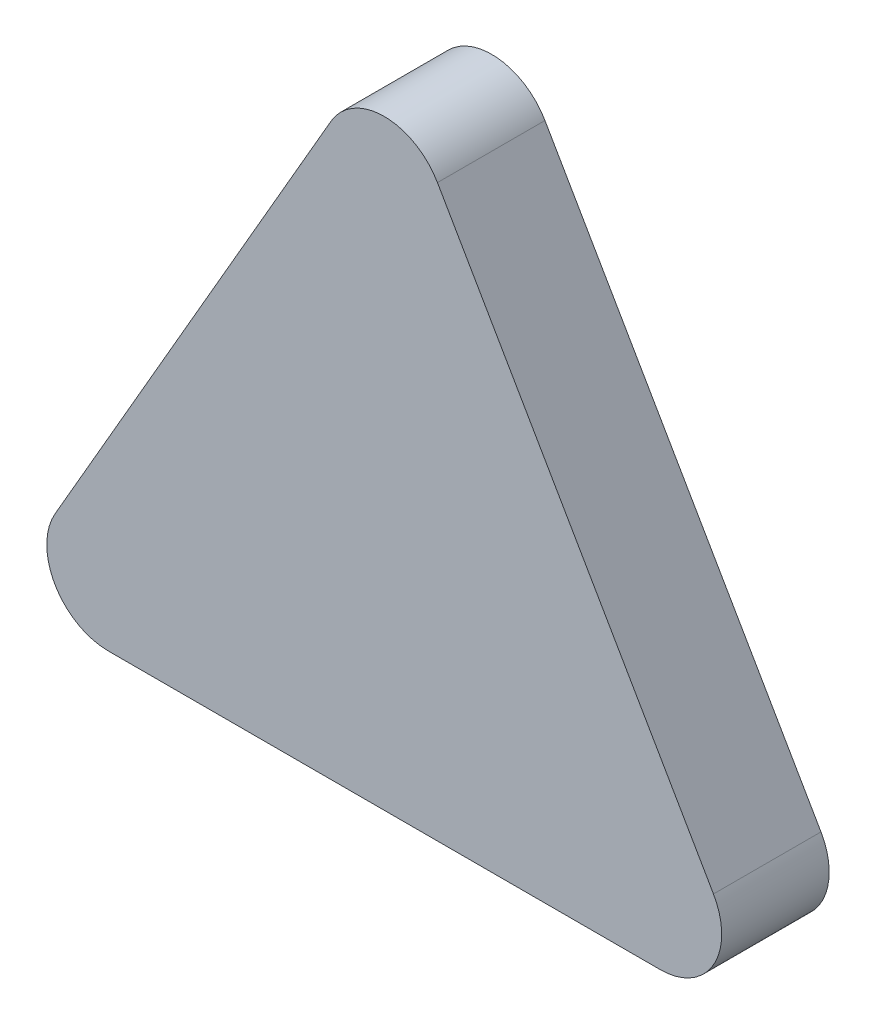
ISO-10303-21;
HEADER;
FILE_DESCRIPTION(('STEP AP214'),'2;1');
FILE_NAME('part.step','',(''),(''),'','','');
FILE_SCHEMA(('AUTOMOTIVE_DESIGN { 1 0 10303 214 1 1 1 1 }'));
ENDSEC;
DATA;
#1=APPLICATION_CONTEXT('core data for automotive mechanical design processes');
#2=APPLICATION_PROTOCOL_DEFINITION('international standard','automotive_design',2000,#1);
#3=PRODUCT_CONTEXT('',#1,'mechanical');
#4=PRODUCT('Part','Part','',(#3));
#5=PRODUCT_RELATED_PRODUCT_CATEGORY('part','',(#4));
#6=PRODUCT_DEFINITION_FORMATION('','',#4);
#7=PRODUCT_DEFINITION_CONTEXT('part definition',#1,'design');
#8=PRODUCT_DEFINITION('design','',#6,#7);
#9=PRODUCT_DEFINITION_SHAPE('','',#8);
#10=(LENGTH_UNIT() NAMED_UNIT(*) SI_UNIT(.MILLI.,.METRE.));
#11=(NAMED_UNIT(*) PLANE_ANGLE_UNIT() SI_UNIT($,.RADIAN.));
#12=(NAMED_UNIT(*) SI_UNIT($,.STERADIAN.) SOLID_ANGLE_UNIT());
#13=UNCERTAINTY_MEASURE_WITH_UNIT(LENGTH_MEASURE(1.E-05),#10,'distance_accuracy_value','');
#14=(GEOMETRIC_REPRESENTATION_CONTEXT(3) GLOBAL_UNCERTAINTY_ASSIGNED_CONTEXT((#13)) GLOBAL_UNIT_ASSIGNED_CONTEXT((#10,
#11,#12)) REPRESENTATION_CONTEXT('',''));
#15=CARTESIAN_POINT('',(0.,0.,0.));
#16=DIRECTION('',(0.,0.,1.));
#17=DIRECTION('',(1.,0.,0.));
#18=AXIS2_PLACEMENT_3D('',#15,#16,#17);
#19=CARTESIAN_POINT('',(0.,21.5640325542325,3.5));
#20=DIRECTION('',(0.866025403784439,-0.5,0.));
#21=DIRECTION('',(0.5,0.866025403784439,0.));
#22=AXIS2_PLACEMENT_3D('',#19,#20,#21);
#23=PLANE('',#22);
#24=DIRECTION('',(-0.5,-0.866025403784439,0.));
#25=VECTOR('',#24,1.);
#26=CARTESIAN_POINT('',(0.,21.5640325542325,0.));
#27=LINE('',#26,#25);
#28=CARTESIAN_POINT('',(-1.73205080756888,18.5640325542325,0.));
#29=VERTEX_POINT('',#28);
#30=CARTESIAN_POINT('',(-10.7179491924311,3.,0.));
#31=VERTEX_POINT('',#30);
#32=EDGE_CURVE('E149',#29,#31,#27,.T.);
#33=ORIENTED_EDGE('',*,*,#32,.T.);
#34=DIRECTION('',(0.,0.,-1.));
#35=VECTOR('',#34,1.);
#36=CARTESIAN_POINT('',(-10.7179491924311,3.,3.5));
#37=LINE('',#36,#35);
#38=CARTESIAN_POINT('',(-10.7179491924311,3.,3.5));
#39=VERTEX_POINT('',#38);
#40=EDGE_CURVE('E12',#31,#39,#37,.F.);
#41=ORIENTED_EDGE('',*,*,#40,.T.);
#42=DIRECTION('',(-0.5,-0.866025403784439,0.));
#43=VECTOR('',#42,1.);
#44=CARTESIAN_POINT('',(0.,21.5640325542325,3.5));
#45=LINE('',#44,#43);
#46=CARTESIAN_POINT('',(-1.73205080756888,18.5640325542325,3.5));
#47=VERTEX_POINT('',#46);
#48=EDGE_CURVE('E150',#47,#39,#45,.T.);
#49=ORIENTED_EDGE('',*,*,#48,.F.);
#50=DIRECTION('',(0.,0.,-1.));
#51=VECTOR('',#50,1.);
#52=CARTESIAN_POINT('',(-1.73205080756888,18.5640325542325,3.5));
#53=LINE('',#52,#51);
#54=EDGE_CURVE('E42',#47,#29,#53,.T.);
#55=ORIENTED_EDGE('',*,*,#54,.T.);
#56=EDGE_LOOP('',(#33,#41,#49,#55));
#57=FACE_BOUND('',#56,.T.);
#58=ADVANCED_FACE('F34',(#57),#23,.F.);
#59=CARTESIAN_POINT('',(-12.45,0.,3.5));
#60=DIRECTION('',(0.,1.,0.));
#61=DIRECTION('',(0.,0.,1.));
#62=AXIS2_PLACEMENT_3D('',#59,#60,#61);
#63=PLANE('',#62);
#64=DIRECTION('',(1.,0.,0.));
#65=VECTOR('',#64,1.);
#66=CARTESIAN_POINT('',(-12.45,0.,0.));
#67=LINE('',#66,#65);
#68=CARTESIAN_POINT('',(-8.98589838486225,0.,0.));
#69=VERTEX_POINT('',#68);
#70=CARTESIAN_POINT('',(8.98589838486225,0.,0.));
#71=VERTEX_POINT('',#70);
#72=EDGE_CURVE('E160',#69,#71,#67,.T.);
#73=ORIENTED_EDGE('',*,*,#72,.T.);
#74=DIRECTION('',(0.,0.,-1.));
#75=VECTOR('',#74,1.);
#76=CARTESIAN_POINT('',(8.98589838486225,0.,3.5));
#77=LINE('',#76,#75);
#78=CARTESIAN_POINT('',(8.98589838486225,0.,3.5));
#79=VERTEX_POINT('',#78);
#80=EDGE_CURVE('E178',#71,#79,#77,.F.);
#81=ORIENTED_EDGE('',*,*,#80,.T.);
#82=DIRECTION('',(1.,0.,0.));
#83=VECTOR('',#82,1.);
#84=CARTESIAN_POINT('',(-12.45,0.,3.5));
#85=LINE('',#84,#83);
#86=CARTESIAN_POINT('',(-8.98589838486225,0.,3.5));
#87=VERTEX_POINT('',#86);
#88=EDGE_CURVE('E152',#87,#79,#85,.T.);
#89=ORIENTED_EDGE('',*,*,#88,.F.);
#90=DIRECTION('',(0.,0.,-1.));
#91=VECTOR('',#90,1.);
#92=CARTESIAN_POINT('',(-8.98589838486225,0.,3.5));
#93=LINE('',#92,#91);
#94=EDGE_CURVE('E175',#87,#69,#93,.T.);
#95=ORIENTED_EDGE('',*,*,#94,.T.);
#96=EDGE_LOOP('',(#73,#81,#89,#95));
#97=FACE_BOUND('',#96,.T.);
#98=ADVANCED_FACE('F198',(#97),#63,.F.);
#99=CARTESIAN_POINT('',(12.45,0.,3.5));
#100=DIRECTION('',(-0.866025403784439,-0.5,0.));
#101=DIRECTION('',(0.5,-0.866025403784439,0.));
#102=AXIS2_PLACEMENT_3D('',#99,#100,#101);
#103=PLANE('',#102);
#104=DIRECTION('',(-0.5,0.866025403784439,0.));
#105=VECTOR('',#104,1.);
#106=CARTESIAN_POINT('',(12.45,0.,3.5));
#107=LINE('',#106,#105);
#108=CARTESIAN_POINT('',(10.7179491924311,3.,3.5));
#109=VERTEX_POINT('',#108);
#110=CARTESIAN_POINT('',(1.73205080756888,18.5640325542325,3.5));
#111=VERTEX_POINT('',#110);
#112=EDGE_CURVE('E156',#109,#111,#107,.T.);
#113=ORIENTED_EDGE('',*,*,#112,.F.);
#114=DIRECTION('',(0.,0.,-1.));
#115=VECTOR('',#114,1.);
#116=CARTESIAN_POINT('',(10.7179491924311,3.,3.5));
#117=LINE('',#116,#115);
#118=CARTESIAN_POINT('',(10.7179491924311,3.,0.));
#119=VERTEX_POINT('',#118);
#120=EDGE_CURVE('E166',#109,#119,#117,.T.);
#121=ORIENTED_EDGE('',*,*,#120,.T.);
#122=DIRECTION('',(-0.5,0.866025403784439,0.));
#123=VECTOR('',#122,1.);
#124=CARTESIAN_POINT('',(12.45,0.,0.));
#125=LINE('',#124,#123);
#126=CARTESIAN_POINT('',(1.73205080756888,18.5640325542325,0.));
#127=VERTEX_POINT('',#126);
#128=EDGE_CURVE('E153',#119,#127,#125,.T.);
#129=ORIENTED_EDGE('',*,*,#128,.T.);
#130=DIRECTION('',(0.,0.,-1.));
#131=VECTOR('',#130,1.);
#132=CARTESIAN_POINT('',(1.73205080756888,18.5640325542325,3.5));
#133=LINE('',#132,#131);
#134=EDGE_CURVE('E158',#127,#111,#133,.F.);
#135=ORIENTED_EDGE('',*,*,#134,.T.);
#136=EDGE_LOOP('',(#113,#121,#129,#135));
#137=FACE_BOUND('',#136,.T.);
#138=ADVANCED_FACE('F207',(#137),#103,.F.);
#139=CARTESIAN_POINT('',(0.,0.,3.5));
#140=DIRECTION('',(0.,0.,1.));
#141=DIRECTION('',(1.,0.,0.));
#142=AXIS2_PLACEMENT_3D('',#139,#140,#141);
#143=PLANE('',#142);
#144=ORIENTED_EDGE('',*,*,#88,.T.);
#145=CARTESIAN_POINT('',(8.98589838486225,2.,3.5));
#146=DIRECTION('',(0.,0.,1.));
#147=DIRECTION('',(1.,0.,0.));
#148=AXIS2_PLACEMENT_3D('',#145,#146,#147);
#149=CIRCLE('',#148,2.);
#150=EDGE_CURVE('E183',#79,#109,#149,.T.);
#151=ORIENTED_EDGE('',*,*,#150,.T.);
#152=ORIENTED_EDGE('',*,*,#112,.T.);
#153=CARTESIAN_POINT('',(0.,17.5640325542325,3.5));
#154=DIRECTION('',(0.,0.,1.));
#155=DIRECTION('',(1.,0.,0.));
#156=AXIS2_PLACEMENT_3D('',#153,#154,#155);
#157=CIRCLE('',#156,2.);
#158=EDGE_CURVE('E54',#111,#47,#157,.T.);
#159=ORIENTED_EDGE('',*,*,#158,.T.);
#160=ORIENTED_EDGE('',*,*,#48,.T.);
#161=CARTESIAN_POINT('',(-8.98589838486225,2.,3.5));
#162=DIRECTION('',(0.,0.,1.));
#163=DIRECTION('',(1.,0.,0.));
#164=AXIS2_PLACEMENT_3D('',#161,#162,#163);
#165=CIRCLE('',#164,2.);
#166=EDGE_CURVE('E181',#39,#87,#165,.T.);
#167=ORIENTED_EDGE('',*,*,#166,.T.);
#168=EDGE_LOOP('',(#144,#151,#152,#159,#160,#167));
#169=FACE_BOUND('',#168,.T.);
#170=ADVANCED_FACE('F201',(#169),#143,.T.);
#171=CARTESIAN_POINT('',(0.,0.,0.));
#172=DIRECTION('',(0.,0.,1.));
#173=DIRECTION('',(1.,0.,0.));
#174=AXIS2_PLACEMENT_3D('',#171,#172,#173);
#175=PLANE('',#174);
#176=DIRECTION('',(0.,-1.,0.));
#177=VECTOR('',#176,1.);
#178=CARTESIAN_POINT('',(-2.,7.87483339501605,0.));
#179=LINE('',#178,#177);
#180=CARTESIAN_POINT('',(-2.,7.87483339501605,0.));
#181=VERTEX_POINT('',#180);
#182=CARTESIAN_POINT('',(-2.,3.87483339501605,0.));
#183=VERTEX_POINT('',#182);
#184=EDGE_CURVE('E146',#181,#183,#179,.T.);
#185=ORIENTED_EDGE('',*,*,#184,.T.);
#186=DIRECTION('',(-1.,0.,0.));
#187=VECTOR('',#186,1.);
#188=CARTESIAN_POINT('',(2.,3.87483339501605,0.));
#189=LINE('',#188,#187);
#190=CARTESIAN_POINT('',(2.,3.87483339501605,0.));
#191=VERTEX_POINT('',#190);
#192=EDGE_CURVE('E129',#191,#183,#189,.T.);
#193=ORIENTED_EDGE('',*,*,#192,.F.);
#194=DIRECTION('',(0.,-1.,0.));
#195=VECTOR('',#194,1.);
#196=CARTESIAN_POINT('',(2.,7.87483339501605,0.));
#197=LINE('',#196,#195);
#198=CARTESIAN_POINT('',(2.,7.87483339501605,0.));
#199=VERTEX_POINT('',#198);
#200=EDGE_CURVE('E121',#199,#191,#197,.T.);
#201=ORIENTED_EDGE('',*,*,#200,.F.);
#202=DIRECTION('',(-1.,0.,0.));
#203=VECTOR('',#202,1.);
#204=CARTESIAN_POINT('',(2.,7.87483339501605,0.));
#205=LINE('',#204,#203);
#206=EDGE_CURVE('E141',#199,#181,#205,.T.);
#207=ORIENTED_EDGE('',*,*,#206,.T.);
#208=EDGE_LOOP('',(#185,#193,#201,#207));
#209=FACE_BOUND('',#208,.T.);
#210=ORIENTED_EDGE('',*,*,#128,.F.);
#211=CARTESIAN_POINT('',(8.98589838486225,2.,0.));
#212=DIRECTION('',(0.,0.,1.));
#213=DIRECTION('',(1.,0.,0.));
#214=AXIS2_PLACEMENT_3D('',#211,#212,#213);
#215=CIRCLE('',#214,2.);
#216=EDGE_CURVE('E173',#119,#71,#215,.F.);
#217=ORIENTED_EDGE('',*,*,#216,.T.);
#218=ORIENTED_EDGE('',*,*,#72,.F.);
#219=CARTESIAN_POINT('',(-8.98589838486225,2.,0.));
#220=DIRECTION('',(0.,0.,1.));
#221=DIRECTION('',(1.,0.,0.));
#222=AXIS2_PLACEMENT_3D('',#219,#220,#221);
#223=CIRCLE('',#222,2.);
#224=EDGE_CURVE('E171',#69,#31,#223,.F.);
#225=ORIENTED_EDGE('',*,*,#224,.T.);
#226=ORIENTED_EDGE('',*,*,#32,.F.);
#227=CARTESIAN_POINT('',(0.,17.5640325542325,0.));
#228=DIRECTION('',(0.,0.,1.));
#229=DIRECTION('',(1.,0.,0.));
#230=AXIS2_PLACEMENT_3D('',#227,#228,#229);
#231=CIRCLE('',#230,2.);
#232=EDGE_CURVE('E169',#29,#127,#231,.F.);
#233=ORIENTED_EDGE('',*,*,#232,.T.);
#234=EDGE_LOOP('',(#210,#217,#218,#225,#226,#233));
#235=FACE_BOUND('',#234,.T.);
#236=ADVANCED_FACE('F190',(#209,#235),#175,.F.);
#237=CARTESIAN_POINT('',(0.,0.,2.9));
#238=DIRECTION('',(0.,0.,1.));
#239=DIRECTION('',(1.,0.,0.));
#240=AXIS2_PLACEMENT_3D('',#237,#238,#239);
#241=PLANE('',#240);
#242=DIRECTION('',(0.,-1.,0.));
#243=VECTOR('',#242,1.);
#244=CARTESIAN_POINT('',(2.,7.87483339501605,2.9));
#245=LINE('',#244,#243);
#246=CARTESIAN_POINT('',(2.,7.87483339501605,2.9));
#247=VERTEX_POINT('',#246);
#248=CARTESIAN_POINT('',(2.,3.87483339501605,2.9));
#249=VERTEX_POINT('',#248);
#250=EDGE_CURVE('E133',#247,#249,#245,.T.);
#251=ORIENTED_EDGE('',*,*,#250,.T.);
#252=DIRECTION('',(-1.,0.,0.));
#253=VECTOR('',#252,1.);
#254=CARTESIAN_POINT('',(2.,3.87483339501605,2.9));
#255=LINE('',#254,#253);
#256=CARTESIAN_POINT('',(-2.,3.87483339501605,2.9));
#257=VERTEX_POINT('',#256);
#258=EDGE_CURVE('E126',#249,#257,#255,.T.);
#259=ORIENTED_EDGE('',*,*,#258,.T.);
#260=DIRECTION('',(0.,-1.,0.));
#261=VECTOR('',#260,1.);
#262=CARTESIAN_POINT('',(-2.,7.87483339501605,2.9));
#263=LINE('',#262,#261);
#264=CARTESIAN_POINT('',(-2.,7.87483339501605,2.9));
#265=VERTEX_POINT('',#264);
#266=EDGE_CURVE('E111',#265,#257,#263,.T.);
#267=ORIENTED_EDGE('',*,*,#266,.F.);
#268=DIRECTION('',(-1.,0.,0.));
#269=VECTOR('',#268,1.);
#270=CARTESIAN_POINT('',(2.,7.87483339501605,2.9));
#271=LINE('',#270,#269);
#272=EDGE_CURVE('E122',#247,#265,#271,.T.);
#273=ORIENTED_EDGE('',*,*,#272,.F.);
#274=EDGE_LOOP('',(#251,#259,#267,#273));
#275=FACE_BOUND('',#274,.T.);
#276=ADVANCED_FACE('F132',(#275),#241,.F.);
#277=CARTESIAN_POINT('',(2.,3.87483339501605,9.15685424949238));
#278=DIRECTION('',(0.,-1.,0.));
#279=DIRECTION('',(0.,0.,-1.));
#280=AXIS2_PLACEMENT_3D('',#277,#278,#279);
#281=PLANE('',#280);
#282=DIRECTION('',(0.,0.,-1.));
#283=VECTOR('',#282,1.);
#284=CARTESIAN_POINT('',(2.,3.87483339501605,9.15685424949238));
#285=LINE('',#284,#283);
#286=EDGE_CURVE('E140',#249,#191,#285,.T.);
#287=ORIENTED_EDGE('',*,*,#286,.T.);
#288=ORIENTED_EDGE('',*,*,#192,.T.);
#289=DIRECTION('',(0.,0.,-1.));
#290=VECTOR('',#289,1.);
#291=CARTESIAN_POINT('',(-2.,3.87483339501605,9.15685424949238));
#292=LINE('',#291,#290);
#293=EDGE_CURVE('E115',#257,#183,#292,.T.);
#294=ORIENTED_EDGE('',*,*,#293,.F.);
#295=ORIENTED_EDGE('',*,*,#258,.F.);
#296=EDGE_LOOP('',(#287,#288,#294,#295));
#297=FACE_BOUND('',#296,.T.);
#298=ADVANCED_FACE('F125',(#297),#281,.F.);
#299=CARTESIAN_POINT('',(-2.,7.87483339501605,9.15685424949238));
#300=DIRECTION('',(1.,0.,0.));
#301=DIRECTION('',(0.,1.,0.));
#302=AXIS2_PLACEMENT_3D('',#299,#300,#301);
#303=PLANE('',#302);
#304=ORIENTED_EDGE('',*,*,#266,.T.);
#305=ORIENTED_EDGE('',*,*,#293,.T.);
#306=ORIENTED_EDGE('',*,*,#184,.F.);
#307=DIRECTION('',(0.,0.,-1.));
#308=VECTOR('',#307,1.);
#309=CARTESIAN_POINT('',(-2.,7.87483339501605,9.15685424949238));
#310=LINE('',#309,#308);
#311=EDGE_CURVE('E117',#265,#181,#310,.T.);
#312=ORIENTED_EDGE('',*,*,#311,.F.);
#313=EDGE_LOOP('',(#304,#305,#306,#312));
#314=FACE_BOUND('',#313,.T.);
#315=ADVANCED_FACE('F113',(#314),#303,.T.);
#316=CARTESIAN_POINT('',(2.,7.87483339501605,9.15685424949238));
#317=DIRECTION('',(0.,-1.,0.));
#318=DIRECTION('',(0.,0.,-1.));
#319=AXIS2_PLACEMENT_3D('',#316,#317,#318);
#320=PLANE('',#319);
#321=ORIENTED_EDGE('',*,*,#272,.T.);
#322=ORIENTED_EDGE('',*,*,#311,.T.);
#323=ORIENTED_EDGE('',*,*,#206,.F.);
#324=DIRECTION('',(0.,0.,-1.));
#325=VECTOR('',#324,1.);
#326=CARTESIAN_POINT('',(2.,7.87483339501605,9.15685424949238));
#327=LINE('',#326,#325);
#328=EDGE_CURVE('E143',#247,#199,#327,.T.);
#329=ORIENTED_EDGE('',*,*,#328,.F.);
#330=EDGE_LOOP('',(#321,#322,#323,#329));
#331=FACE_BOUND('',#330,.T.);
#332=ADVANCED_FACE('F226',(#331),#320,.T.);
#333=CARTESIAN_POINT('',(2.,7.87483339501605,9.15685424949238));
#334=DIRECTION('',(1.,0.,0.));
#335=DIRECTION('',(0.,1.,0.));
#336=AXIS2_PLACEMENT_3D('',#333,#334,#335);
#337=PLANE('',#336);
#338=ORIENTED_EDGE('',*,*,#328,.T.);
#339=ORIENTED_EDGE('',*,*,#200,.T.);
#340=ORIENTED_EDGE('',*,*,#286,.F.);
#341=ORIENTED_EDGE('',*,*,#250,.F.);
#342=EDGE_LOOP('',(#338,#339,#340,#341));
#343=FACE_BOUND('',#342,.T.);
#344=ADVANCED_FACE('F222',(#343),#337,.F.);
#345=CARTESIAN_POINT('',(8.98589838486225,2.,3.5));
#346=DIRECTION('',(0.,0.,-1.));
#347=DIRECTION('',(-1.,0.,0.));
#348=AXIS2_PLACEMENT_3D('',#345,#346,#347);
#349=CYLINDRICAL_SURFACE('',#348,2.);
#350=ORIENTED_EDGE('',*,*,#150,.F.);
#351=ORIENTED_EDGE('',*,*,#80,.F.);
#352=ORIENTED_EDGE('',*,*,#216,.F.);
#353=ORIENTED_EDGE('',*,*,#120,.F.);
#354=EDGE_LOOP('',(#350,#351,#352,#353));
#355=FACE_BOUND('',#354,.T.);
#356=ADVANCED_FACE('F205',(#355),#349,.T.);
#357=CARTESIAN_POINT('',(-8.98589838486225,2.,3.5));
#358=DIRECTION('',(0.,0.,-1.));
#359=DIRECTION('',(-1.,0.,0.));
#360=AXIS2_PLACEMENT_3D('',#357,#358,#359);
#361=CYLINDRICAL_SURFACE('',#360,2.);
#362=ORIENTED_EDGE('',*,*,#166,.F.);
#363=ORIENTED_EDGE('',*,*,#40,.F.);
#364=ORIENTED_EDGE('',*,*,#224,.F.);
#365=ORIENTED_EDGE('',*,*,#94,.F.);
#366=EDGE_LOOP('',(#362,#363,#364,#365));
#367=FACE_BOUND('',#366,.T.);
#368=ADVANCED_FACE('F195',(#367),#361,.T.);
#369=CARTESIAN_POINT('',(0.,17.5640325542325,3.5));
#370=DIRECTION('',(0.,0.,-1.));
#371=DIRECTION('',(-1.,0.,0.));
#372=AXIS2_PLACEMENT_3D('',#369,#370,#371);
#373=CYLINDRICAL_SURFACE('',#372,2.);
#374=ORIENTED_EDGE('',*,*,#158,.F.);
#375=ORIENTED_EDGE('',*,*,#134,.F.);
#376=ORIENTED_EDGE('',*,*,#232,.F.);
#377=ORIENTED_EDGE('',*,*,#54,.F.);
#378=EDGE_LOOP('',(#374,#375,#376,#377));
#379=FACE_BOUND('',#378,.T.);
#380=ADVANCED_FACE('F36',(#379),#373,.T.);
#381=CLOSED_SHELL('',(#58,#98,#138,#170,#236,#276,#298,#315,#332,#344,#356,#368,#380));
#382=MANIFOLD_SOLID_BREP('B2',#381);
#383=ADVANCED_BREP_SHAPE_REPRESENTATION('',(#18,#382),#14);
#384=SHAPE_DEFINITION_REPRESENTATION(#9,#383);
ENDSEC;
END-ISO-10303-21;
